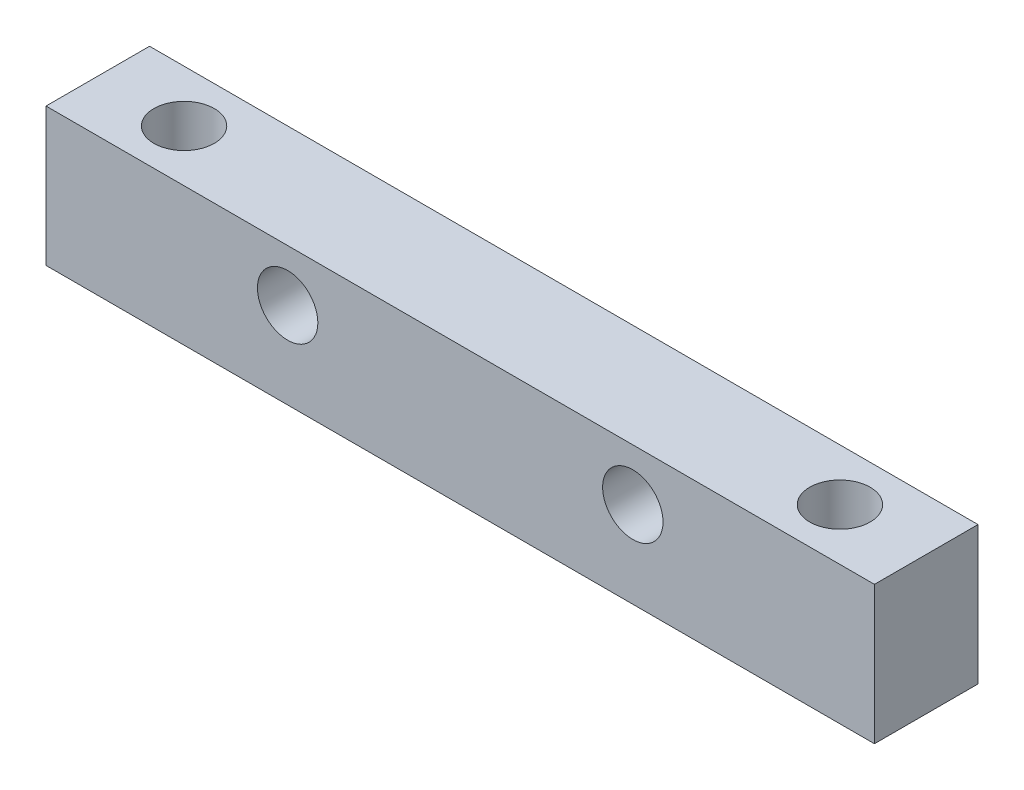
ISO-10303-21;
HEADER;
FILE_DESCRIPTION(('STEP AP214'),'2;1');
FILE_NAME('part.step','',(''),(''),'','','');
FILE_SCHEMA(('AUTOMOTIVE_DESIGN { 1 0 10303 214 1 1 1 1 }'));
ENDSEC;
DATA;
#1=APPLICATION_CONTEXT('core data for automotive mechanical design processes');
#2=APPLICATION_PROTOCOL_DEFINITION('international standard','automotive_design',2000,#1);
#3=PRODUCT_CONTEXT('',#1,'mechanical');
#4=PRODUCT('Part','Part','',(#3));
#5=PRODUCT_RELATED_PRODUCT_CATEGORY('part','',(#4));
#6=PRODUCT_DEFINITION_FORMATION('','',#4);
#7=PRODUCT_DEFINITION_CONTEXT('part definition',#1,'design');
#8=PRODUCT_DEFINITION('design','',#6,#7);
#9=PRODUCT_DEFINITION_SHAPE('','',#8);
#10=(LENGTH_UNIT() NAMED_UNIT(*) SI_UNIT(.MILLI.,.METRE.));
#11=(NAMED_UNIT(*) PLANE_ANGLE_UNIT() SI_UNIT($,.RADIAN.));
#12=(NAMED_UNIT(*) SI_UNIT($,.STERADIAN.) SOLID_ANGLE_UNIT());
#13=UNCERTAINTY_MEASURE_WITH_UNIT(LENGTH_MEASURE(1.E-05),#10,'distance_accuracy_value','');
#14=(GEOMETRIC_REPRESENTATION_CONTEXT(3) GLOBAL_UNCERTAINTY_ASSIGNED_CONTEXT((#13)) GLOBAL_UNIT_ASSIGNED_CONTEXT((#10,
#11,#12)) REPRESENTATION_CONTEXT('',''));
#15=CARTESIAN_POINT('',(0.,0.,0.));
#16=DIRECTION('',(0.,0.,1.));
#17=DIRECTION('',(1.,0.,0.));
#18=AXIS2_PLACEMENT_3D('',#15,#16,#17);
#19=CARTESIAN_POINT('',(0.,8.,0.));
#20=DIRECTION('',(0.,-1.,0.));
#21=DIRECTION('',(0.,0.,-1.));
#22=AXIS2_PLACEMENT_3D('',#19,#20,#21);
#23=PLANE('',#22);
#24=DIRECTION('',(0.,0.,1.));
#25=VECTOR('',#24,1.);
#26=CARTESIAN_POINT('',(-5.,8.,3.));
#27=LINE('',#26,#25);
#28=CARTESIAN_POINT('',(-5.,8.,-3.));
#29=VERTEX_POINT('',#28);
#30=CARTESIAN_POINT('',(-5.,8.,3.));
#31=VERTEX_POINT('',#30);
#32=EDGE_CURVE('E88',#29,#31,#27,.T.);
#33=ORIENTED_EDGE('',*,*,#32,.T.);
#34=DIRECTION('',(1.,0.,0.));
#35=VECTOR('',#34,1.);
#36=CARTESIAN_POINT('',(-5.,8.,3.));
#37=LINE('',#36,#35);
#38=CARTESIAN_POINT('',(43.,8.,3.));
#39=VERTEX_POINT('',#38);
#40=EDGE_CURVE('E83',#31,#39,#37,.T.);
#41=ORIENTED_EDGE('',*,*,#40,.T.);
#42=DIRECTION('',(0.,0.,-1.));
#43=VECTOR('',#42,1.);
#44=CARTESIAN_POINT('',(43.,8.,3.));
#45=LINE('',#44,#43);
#46=CARTESIAN_POINT('',(43.,8.,-3.));
#47=VERTEX_POINT('',#46);
#48=EDGE_CURVE('E86',#39,#47,#45,.T.);
#49=ORIENTED_EDGE('',*,*,#48,.T.);
#50=DIRECTION('',(-1.,0.,0.));
#51=VECTOR('',#50,1.);
#52=CARTESIAN_POINT('',(-5.,8.,-3.));
#53=LINE('',#52,#51);
#54=EDGE_CURVE('E53',#47,#29,#53,.T.);
#55=ORIENTED_EDGE('',*,*,#54,.T.);
#56=EDGE_LOOP('',(#33,#41,#49,#55));
#57=FACE_BOUND('',#56,.T.);
#58=CARTESIAN_POINT('',(0.,8.,0.));
#59=DIRECTION('',(0.,1.,0.));
#60=DIRECTION('',(0.,0.,1.));
#61=AXIS2_PLACEMENT_3D('',#58,#59,#60);
#62=CIRCLE('',#61,1.75);
#63=CARTESIAN_POINT('',(0.,8.,1.75));
#64=VERTEX_POINT('',#63);
#65=EDGE_CURVE('E103',#64,#64,#62,.T.);
#66=ORIENTED_EDGE('',*,*,#65,.F.);
#67=EDGE_LOOP('',(#66));
#68=FACE_BOUND('',#67,.T.);
#69=CARTESIAN_POINT('',(38.,8.,0.));
#70=DIRECTION('',(0.,1.,0.));
#71=DIRECTION('',(0.,0.,1.));
#72=AXIS2_PLACEMENT_3D('',#69,#70,#71);
#73=CIRCLE('',#72,1.75);
#74=CARTESIAN_POINT('',(38.,8.,1.75));
#75=VERTEX_POINT('',#74);
#76=EDGE_CURVE('E118',#75,#75,#73,.T.);
#77=ORIENTED_EDGE('',*,*,#76,.F.);
#78=EDGE_LOOP('',(#77));
#79=FACE_BOUND('',#78,.T.);
#80=ADVANCED_FACE('F36',(#57,#68,#79),#23,.F.);
#81=CARTESIAN_POINT('',(0.,0.,0.));
#82=DIRECTION('',(0.,-1.,0.));
#83=DIRECTION('',(0.,0.,-1.));
#84=AXIS2_PLACEMENT_3D('',#81,#82,#83);
#85=PLANE('',#84);
#86=CARTESIAN_POINT('',(0.,0.,0.));
#87=DIRECTION('',(0.,1.,0.));
#88=DIRECTION('',(0.,0.,1.));
#89=AXIS2_PLACEMENT_3D('',#86,#87,#88);
#90=CIRCLE('',#89,1.75);
#91=CARTESIAN_POINT('',(0.,0.,1.75));
#92=VERTEX_POINT('',#91);
#93=EDGE_CURVE('E115',#92,#92,#90,.T.);
#94=ORIENTED_EDGE('',*,*,#93,.T.);
#95=EDGE_LOOP('',(#94));
#96=FACE_BOUND('',#95,.T.);
#97=DIRECTION('',(0.,0.,1.));
#98=VECTOR('',#97,1.);
#99=CARTESIAN_POINT('',(-5.,0.,3.));
#100=LINE('',#99,#98);
#101=CARTESIAN_POINT('',(-5.,0.,-3.));
#102=VERTEX_POINT('',#101);
#103=CARTESIAN_POINT('',(-5.,0.,3.));
#104=VERTEX_POINT('',#103);
#105=EDGE_CURVE('E100',#102,#104,#100,.T.);
#106=ORIENTED_EDGE('',*,*,#105,.F.);
#107=DIRECTION('',(-1.,0.,0.));
#108=VECTOR('',#107,1.);
#109=CARTESIAN_POINT('',(-5.,0.,-3.));
#110=LINE('',#109,#108);
#111=CARTESIAN_POINT('',(43.,0.,-3.));
#112=VERTEX_POINT('',#111);
#113=EDGE_CURVE('E76',#112,#102,#110,.T.);
#114=ORIENTED_EDGE('',*,*,#113,.F.);
#115=DIRECTION('',(0.,0.,-1.));
#116=VECTOR('',#115,1.);
#117=CARTESIAN_POINT('',(43.,0.,3.));
#118=LINE('',#117,#116);
#119=CARTESIAN_POINT('',(43.,0.,3.));
#120=VERTEX_POINT('',#119);
#121=EDGE_CURVE('E70',#120,#112,#118,.T.);
#122=ORIENTED_EDGE('',*,*,#121,.F.);
#123=DIRECTION('',(1.,0.,0.));
#124=VECTOR('',#123,1.);
#125=CARTESIAN_POINT('',(-5.,0.,3.));
#126=LINE('',#125,#124);
#127=EDGE_CURVE('E92',#104,#120,#126,.T.);
#128=ORIENTED_EDGE('',*,*,#127,.F.);
#129=EDGE_LOOP('',(#106,#114,#122,#128));
#130=FACE_BOUND('',#129,.T.);
#131=CARTESIAN_POINT('',(38.,0.,0.));
#132=DIRECTION('',(0.,1.,0.));
#133=DIRECTION('',(0.,0.,1.));
#134=AXIS2_PLACEMENT_3D('',#131,#132,#133);
#135=CIRCLE('',#134,1.75);
#136=CARTESIAN_POINT('',(38.,0.,1.75));
#137=VERTEX_POINT('',#136);
#138=EDGE_CURVE('E121',#137,#137,#135,.T.);
#139=ORIENTED_EDGE('',*,*,#138,.T.);
#140=EDGE_LOOP('',(#139));
#141=FACE_BOUND('',#140,.T.);
#142=ADVANCED_FACE('F111',(#96,#130,#141),#85,.T.);
#143=CARTESIAN_POINT('',(-5.,8.,3.));
#144=DIRECTION('',(1.,0.,0.));
#145=DIRECTION('',(0.,0.,-1.));
#146=AXIS2_PLACEMENT_3D('',#143,#144,#145);
#147=PLANE('',#146);
#148=ORIENTED_EDGE('',*,*,#105,.T.);
#149=DIRECTION('',(0.,-1.,0.));
#150=VECTOR('',#149,1.);
#151=CARTESIAN_POINT('',(-5.,8.,3.));
#152=LINE('',#151,#150);
#153=EDGE_CURVE('E11',#31,#104,#152,.T.);
#154=ORIENTED_EDGE('',*,*,#153,.F.);
#155=ORIENTED_EDGE('',*,*,#32,.F.);
#156=DIRECTION('',(0.,-1.,0.));
#157=VECTOR('',#156,1.);
#158=CARTESIAN_POINT('',(-5.,8.,-3.));
#159=LINE('',#158,#157);
#160=EDGE_CURVE('E96',#29,#102,#159,.T.);
#161=ORIENTED_EDGE('',*,*,#160,.T.);
#162=EDGE_LOOP('',(#148,#154,#155,#161));
#163=FACE_BOUND('',#162,.T.);
#164=ADVANCED_FACE('F38',(#163),#147,.F.);
#165=CARTESIAN_POINT('',(-5.,8.,3.));
#166=DIRECTION('',(0.,0.,-1.));
#167=DIRECTION('',(-1.,0.,0.));
#168=AXIS2_PLACEMENT_3D('',#165,#166,#167);
#169=PLANE('',#168);
#170=CARTESIAN_POINT('',(9.,5.,3.));
#171=DIRECTION('',(0.,0.,1.));
#172=DIRECTION('',(1.,0.,0.));
#173=AXIS2_PLACEMENT_3D('',#170,#171,#172);
#174=CIRCLE('',#173,1.75);
#175=CARTESIAN_POINT('',(10.75,5.,3.));
#176=VERTEX_POINT('',#175);
#177=EDGE_CURVE('E133',#176,#176,#174,.T.);
#178=ORIENTED_EDGE('',*,*,#177,.F.);
#179=EDGE_LOOP('',(#178));
#180=FACE_BOUND('',#179,.T.);
#181=CARTESIAN_POINT('',(29.,5.,3.));
#182=DIRECTION('',(0.,0.,1.));
#183=DIRECTION('',(1.,0.,0.));
#184=AXIS2_PLACEMENT_3D('',#181,#182,#183);
#185=CIRCLE('',#184,1.75);
#186=CARTESIAN_POINT('',(30.75,5.,3.));
#187=VERTEX_POINT('',#186);
#188=EDGE_CURVE('E127',#187,#187,#185,.T.);
#189=ORIENTED_EDGE('',*,*,#188,.F.);
#190=EDGE_LOOP('',(#189));
#191=FACE_BOUND('',#190,.T.);
#192=ORIENTED_EDGE('',*,*,#127,.T.);
#193=DIRECTION('',(0.,-1.,0.));
#194=VECTOR('',#193,1.);
#195=CARTESIAN_POINT('',(43.,8.,3.));
#196=LINE('',#195,#194);
#197=EDGE_CURVE('E45',#39,#120,#196,.T.);
#198=ORIENTED_EDGE('',*,*,#197,.F.);
#199=ORIENTED_EDGE('',*,*,#40,.F.);
#200=ORIENTED_EDGE('',*,*,#153,.T.);
#201=EDGE_LOOP('',(#192,#198,#199,#200));
#202=FACE_BOUND('',#201,.T.);
#203=ADVANCED_FACE('F91',(#180,#191,#202),#169,.F.);
#204=CARTESIAN_POINT('',(43.,8.,3.));
#205=DIRECTION('',(-1.,0.,0.));
#206=DIRECTION('',(0.,0.,1.));
#207=AXIS2_PLACEMENT_3D('',#204,#205,#206);
#208=PLANE('',#207);
#209=ORIENTED_EDGE('',*,*,#121,.T.);
#210=DIRECTION('',(0.,-1.,0.));
#211=VECTOR('',#210,1.);
#212=CARTESIAN_POINT('',(43.,8.,-3.));
#213=LINE('',#212,#211);
#214=EDGE_CURVE('E93',#47,#112,#213,.T.);
#215=ORIENTED_EDGE('',*,*,#214,.F.);
#216=ORIENTED_EDGE('',*,*,#48,.F.);
#217=ORIENTED_EDGE('',*,*,#197,.T.);
#218=EDGE_LOOP('',(#209,#215,#216,#217));
#219=FACE_BOUND('',#218,.T.);
#220=ADVANCED_FACE('F94',(#219),#208,.F.);
#221=CARTESIAN_POINT('',(-5.,8.,-3.));
#222=DIRECTION('',(0.,0.,1.));
#223=DIRECTION('',(1.,0.,0.));
#224=AXIS2_PLACEMENT_3D('',#221,#222,#223);
#225=PLANE('',#224);
#226=CARTESIAN_POINT('',(9.,5.,-3.));
#227=DIRECTION('',(0.,0.,1.));
#228=DIRECTION('',(1.,0.,0.));
#229=AXIS2_PLACEMENT_3D('',#226,#227,#228);
#230=CIRCLE('',#229,1.75);
#231=CARTESIAN_POINT('',(10.75,5.,-3.));
#232=VERTEX_POINT('',#231);
#233=EDGE_CURVE('E124',#232,#232,#230,.T.);
#234=ORIENTED_EDGE('',*,*,#233,.T.);
#235=EDGE_LOOP('',(#234));
#236=FACE_BOUND('',#235,.T.);
#237=CARTESIAN_POINT('',(29.,5.,-3.));
#238=DIRECTION('',(0.,0.,1.));
#239=DIRECTION('',(1.,0.,0.));
#240=AXIS2_PLACEMENT_3D('',#237,#238,#239);
#241=CIRCLE('',#240,1.75);
#242=CARTESIAN_POINT('',(30.75,5.,-3.));
#243=VERTEX_POINT('',#242);
#244=EDGE_CURVE('E130',#243,#243,#241,.T.);
#245=ORIENTED_EDGE('',*,*,#244,.T.);
#246=EDGE_LOOP('',(#245));
#247=FACE_BOUND('',#246,.T.);
#248=ORIENTED_EDGE('',*,*,#113,.T.);
#249=ORIENTED_EDGE('',*,*,#160,.F.);
#250=ORIENTED_EDGE('',*,*,#54,.F.);
#251=ORIENTED_EDGE('',*,*,#214,.T.);
#252=EDGE_LOOP('',(#248,#249,#250,#251));
#253=FACE_BOUND('',#252,.T.);
#254=ADVANCED_FACE('F108',(#236,#247,#253),#225,.F.);
#255=CARTESIAN_POINT('',(0.,8.,0.));
#256=DIRECTION('',(0.,-1.,0.));
#257=DIRECTION('',(0.,0.,-1.));
#258=AXIS2_PLACEMENT_3D('',#255,#256,#257);
#259=CYLINDRICAL_SURFACE('',#258,1.75);
#260=ORIENTED_EDGE('',*,*,#65,.T.);
#261=EDGE_LOOP('',(#260));
#262=FACE_BOUND('',#261,.T.);
#263=ORIENTED_EDGE('',*,*,#93,.F.);
#264=EDGE_LOOP('',(#263));
#265=FACE_BOUND('',#264,.T.);
#266=ADVANCED_FACE('F159',(#262,#265),#259,.F.);
#267=CARTESIAN_POINT('',(38.,8.,0.));
#268=DIRECTION('',(0.,-1.,0.));
#269=DIRECTION('',(0.,0.,-1.));
#270=AXIS2_PLACEMENT_3D('',#267,#268,#269);
#271=CYLINDRICAL_SURFACE('',#270,1.75);
#272=ORIENTED_EDGE('',*,*,#76,.T.);
#273=EDGE_LOOP('',(#272));
#274=FACE_BOUND('',#273,.T.);
#275=ORIENTED_EDGE('',*,*,#138,.F.);
#276=EDGE_LOOP('',(#275));
#277=FACE_BOUND('',#276,.T.);
#278=ADVANCED_FACE('F153',(#274,#277),#271,.F.);
#279=CARTESIAN_POINT('',(29.,5.,-3.));
#280=DIRECTION('',(0.,0.,1.));
#281=DIRECTION('',(1.,0.,0.));
#282=AXIS2_PLACEMENT_3D('',#279,#280,#281);
#283=CYLINDRICAL_SURFACE('',#282,1.75);
#284=ORIENTED_EDGE('',*,*,#244,.F.);
#285=EDGE_LOOP('',(#284));
#286=FACE_BOUND('',#285,.T.);
#287=ORIENTED_EDGE('',*,*,#188,.T.);
#288=EDGE_LOOP('',(#287));
#289=FACE_BOUND('',#288,.T.);
#290=ADVANCED_FACE('F144',(#286,#289),#283,.F.);
#291=CARTESIAN_POINT('',(9.,5.,-3.));
#292=DIRECTION('',(0.,0.,1.));
#293=DIRECTION('',(1.,0.,0.));
#294=AXIS2_PLACEMENT_3D('',#291,#292,#293);
#295=CYLINDRICAL_SURFACE('',#294,1.75);
#296=ORIENTED_EDGE('',*,*,#233,.F.);
#297=EDGE_LOOP('',(#296));
#298=FACE_BOUND('',#297,.T.);
#299=ORIENTED_EDGE('',*,*,#177,.T.);
#300=EDGE_LOOP('',(#299));
#301=FACE_BOUND('',#300,.T.);
#302=ADVANCED_FACE('F141',(#298,#301),#295,.F.);
#303=CLOSED_SHELL('',(#80,#142,#164,#203,#220,#254,#266,#278,#290,#302));
#304=MANIFOLD_SOLID_BREP('B2',#303);
#305=ADVANCED_BREP_SHAPE_REPRESENTATION('',(#18,#304),#14);
#306=SHAPE_DEFINITION_REPRESENTATION(#9,#305);
ENDSEC;
END-ISO-10303-21;
